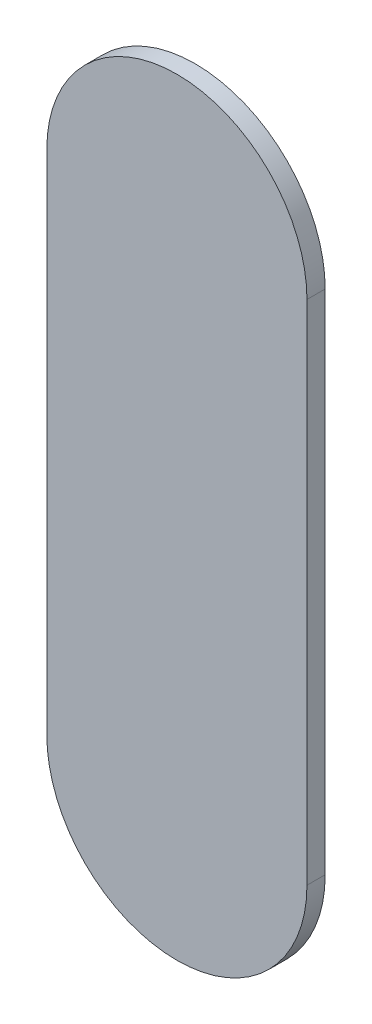
ISO-10303-21;
HEADER;
FILE_DESCRIPTION(('STEP AP214'),'2;1');
FILE_NAME('part.step','',(''),(''),'','','');
FILE_SCHEMA(('AUTOMOTIVE_DESIGN { 1 0 10303 214 1 1 1 1 }'));
ENDSEC;
DATA;
#1=APPLICATION_CONTEXT('core data for automotive mechanical design processes');
#2=APPLICATION_PROTOCOL_DEFINITION('international standard','automotive_design',2000,#1);
#3=PRODUCT_CONTEXT('',#1,'mechanical');
#4=PRODUCT('Part','Part','',(#3));
#5=PRODUCT_RELATED_PRODUCT_CATEGORY('part','',(#4));
#6=PRODUCT_DEFINITION_FORMATION('','',#4);
#7=PRODUCT_DEFINITION_CONTEXT('part definition',#1,'design');
#8=PRODUCT_DEFINITION('design','',#6,#7);
#9=PRODUCT_DEFINITION_SHAPE('','',#8);
#10=(LENGTH_UNIT() NAMED_UNIT(*) SI_UNIT(.MILLI.,.METRE.));
#11=(NAMED_UNIT(*) PLANE_ANGLE_UNIT() SI_UNIT($,.RADIAN.));
#12=(NAMED_UNIT(*) SI_UNIT($,.STERADIAN.) SOLID_ANGLE_UNIT());
#13=UNCERTAINTY_MEASURE_WITH_UNIT(LENGTH_MEASURE(1.E-05),#10,'distance_accuracy_value','');
#14=(GEOMETRIC_REPRESENTATION_CONTEXT(3) GLOBAL_UNCERTAINTY_ASSIGNED_CONTEXT((#13)) GLOBAL_UNIT_ASSIGNED_CONTEXT((#10,
#11,#12)) REPRESENTATION_CONTEXT('',''));
#15=CARTESIAN_POINT('',(0.,0.,0.));
#16=DIRECTION('',(0.,0.,1.));
#17=DIRECTION('',(1.,0.,0.));
#18=AXIS2_PLACEMENT_3D('',#15,#16,#17);
#19=CARTESIAN_POINT('',(83.5775,-106.1525,1.635));
#20=DIRECTION('',(0.,0.,1.));
#21=DIRECTION('',(1.,0.,0.));
#22=AXIS2_PLACEMENT_3D('',#19,#20,#21);
#23=PLANE('',#22);
#24=DIRECTION('',(0.,1.,0.));
#25=VECTOR('',#24,1.);
#26=CARTESIAN_POINT('',(83.5775,-106.1525,1.635));
#27=LINE('',#26,#25);
#28=CARTESIAN_POINT('',(83.5775,-106.1525,1.635));
#29=VERTEX_POINT('',#28);
#30=CARTESIAN_POINT('',(83.5775,-105.1775,1.635));
#31=VERTEX_POINT('',#30);
#32=EDGE_CURVE('E70',#29,#31,#27,.T.);
#33=ORIENTED_EDGE('',*,*,#32,.T.);
#34=CARTESIAN_POINT('',(83.3275,-105.1775,1.635));
#35=DIRECTION('',(0.,0.,1.));
#36=DIRECTION('',(1.,0.,0.));
#37=AXIS2_PLACEMENT_3D('',#34,#35,#36);
#38=CIRCLE('',#37,0.25);
#39=CARTESIAN_POINT('',(83.0775,-105.1775,1.635));
#40=VERTEX_POINT('',#39);
#41=EDGE_CURVE('E68',#31,#40,#38,.T.);
#42=ORIENTED_EDGE('',*,*,#41,.T.);
#43=DIRECTION('',(0.,-1.,0.));
#44=VECTOR('',#43,1.);
#45=CARTESIAN_POINT('',(83.0775,-105.1775,1.635));
#46=LINE('',#45,#44);
#47=CARTESIAN_POINT('',(83.0775,-106.1525,1.635));
#48=VERTEX_POINT('',#47);
#49=EDGE_CURVE('E21',#40,#48,#46,.T.);
#50=ORIENTED_EDGE('',*,*,#49,.T.);
#51=CARTESIAN_POINT('',(83.3275,-106.1525,1.635));
#52=DIRECTION('',(0.,0.,1.));
#53=DIRECTION('',(-1.,0.,0.));
#54=AXIS2_PLACEMENT_3D('',#51,#52,#53);
#55=CIRCLE('',#54,0.25);
#56=EDGE_CURVE('E11',#48,#29,#55,.T.);
#57=ORIENTED_EDGE('',*,*,#56,.T.);
#58=EDGE_LOOP('',(#33,#42,#50,#57));
#59=FACE_BOUND('',#58,.T.);
#60=ADVANCED_FACE('F17',(#59),#23,.T.);
#61=CARTESIAN_POINT('',(83.5775,-106.1525,1.6));
#62=DIRECTION('',(0.,0.,1.));
#63=DIRECTION('',(1.,0.,0.));
#64=AXIS2_PLACEMENT_3D('',#61,#62,#63);
#65=PLANE('',#64);
#66=CARTESIAN_POINT('',(83.3275,-106.1525,1.6));
#67=DIRECTION('',(0.,0.,1.));
#68=DIRECTION('',(-1.,0.,0.));
#69=AXIS2_PLACEMENT_3D('',#66,#67,#68);
#70=CIRCLE('',#69,0.25);
#71=CARTESIAN_POINT('',(83.0775,-106.1525,1.6));
#72=VERTEX_POINT('',#71);
#73=CARTESIAN_POINT('',(83.5775,-106.1525,1.6));
#74=VERTEX_POINT('',#73);
#75=EDGE_CURVE('E28',#72,#74,#70,.T.);
#76=ORIENTED_EDGE('',*,*,#75,.F.);
#77=DIRECTION('',(0.,-1.,0.));
#78=VECTOR('',#77,1.);
#79=CARTESIAN_POINT('',(83.0775,-105.1775,1.6));
#80=LINE('',#79,#78);
#81=CARTESIAN_POINT('',(83.0775,-105.1775,1.6));
#82=VERTEX_POINT('',#81);
#83=EDGE_CURVE('E75',#82,#72,#80,.T.);
#84=ORIENTED_EDGE('',*,*,#83,.F.);
#85=CARTESIAN_POINT('',(83.3275,-105.1775,1.6));
#86=DIRECTION('',(0.,0.,1.));
#87=DIRECTION('',(1.,0.,0.));
#88=AXIS2_PLACEMENT_3D('',#85,#86,#87);
#89=CIRCLE('',#88,0.25);
#90=CARTESIAN_POINT('',(83.5775,-105.1775,1.6));
#91=VERTEX_POINT('',#90);
#92=EDGE_CURVE('E79',#91,#82,#89,.T.);
#93=ORIENTED_EDGE('',*,*,#92,.F.);
#94=DIRECTION('',(0.,1.,0.));
#95=VECTOR('',#94,1.);
#96=CARTESIAN_POINT('',(83.5775,-106.1525,1.6));
#97=LINE('',#96,#95);
#98=EDGE_CURVE('E98',#74,#91,#97,.T.);
#99=ORIENTED_EDGE('',*,*,#98,.F.);
#100=EDGE_LOOP('',(#76,#84,#93,#99));
#101=FACE_BOUND('',#100,.T.);
#102=ADVANCED_FACE('F19',(#101),#65,.F.);
#103=CARTESIAN_POINT('',(83.3275,-106.1525,1.6));
#104=DIRECTION('',(0.,0.,-1.));
#105=DIRECTION('',(-1.,0.,0.));
#106=AXIS2_PLACEMENT_3D('',#103,#104,#105);
#107=CYLINDRICAL_SURFACE('',#106,0.25);
#108=ORIENTED_EDGE('',*,*,#75,.T.);
#109=DIRECTION('',(0.,0.,1.));
#110=VECTOR('',#109,1.);
#111=CARTESIAN_POINT('',(83.5775,-106.1525,1.6));
#112=LINE('',#111,#110);
#113=EDGE_CURVE('E86',#74,#29,#112,.T.);
#114=ORIENTED_EDGE('',*,*,#113,.T.);
#115=ORIENTED_EDGE('',*,*,#56,.F.);
#116=DIRECTION('',(0.,0.,1.));
#117=VECTOR('',#116,1.);
#118=CARTESIAN_POINT('',(83.0775,-106.1525,1.6));
#119=LINE('',#118,#117);
#120=EDGE_CURVE('E63',#72,#48,#119,.T.);
#121=ORIENTED_EDGE('',*,*,#120,.F.);
#122=EDGE_LOOP('',(#108,#114,#115,#121));
#123=FACE_BOUND('',#122,.T.);
#124=ADVANCED_FACE('F109',(#123),#107,.T.);
#125=CARTESIAN_POINT('',(83.0775,-105.1775,1.6));
#126=DIRECTION('',(1.,0.,0.));
#127=DIRECTION('',(0.,1.,0.));
#128=AXIS2_PLACEMENT_3D('',#125,#126,#127);
#129=PLANE('',#128);
#130=ORIENTED_EDGE('',*,*,#83,.T.);
#131=ORIENTED_EDGE('',*,*,#120,.T.);
#132=ORIENTED_EDGE('',*,*,#49,.F.);
#133=DIRECTION('',(0.,0.,1.));
#134=VECTOR('',#133,1.);
#135=CARTESIAN_POINT('',(83.0775,-105.1775,1.6));
#136=LINE('',#135,#134);
#137=EDGE_CURVE('E61',#82,#40,#136,.T.);
#138=ORIENTED_EDGE('',*,*,#137,.F.);
#139=EDGE_LOOP('',(#130,#131,#132,#138));
#140=FACE_BOUND('',#139,.T.);
#141=ADVANCED_FACE('F59',(#140),#129,.F.);
#142=CARTESIAN_POINT('',(83.3275,-105.1775,1.6));
#143=DIRECTION('',(0.,0.,-1.));
#144=DIRECTION('',(1.,0.,0.));
#145=AXIS2_PLACEMENT_3D('',#142,#143,#144);
#146=CYLINDRICAL_SURFACE('',#145,0.25);
#147=ORIENTED_EDGE('',*,*,#92,.T.);
#148=ORIENTED_EDGE('',*,*,#137,.T.);
#149=ORIENTED_EDGE('',*,*,#41,.F.);
#150=DIRECTION('',(0.,0.,1.));
#151=VECTOR('',#150,1.);
#152=CARTESIAN_POINT('',(83.5775,-105.1775,1.6));
#153=LINE('',#152,#151);
#154=EDGE_CURVE('E100',#91,#31,#153,.T.);
#155=ORIENTED_EDGE('',*,*,#154,.F.);
#156=EDGE_LOOP('',(#147,#148,#149,#155));
#157=FACE_BOUND('',#156,.T.);
#158=ADVANCED_FACE('F77',(#157),#146,.T.);
#159=CARTESIAN_POINT('',(83.5775,-106.1525,1.6));
#160=DIRECTION('',(-1.,0.,0.));
#161=DIRECTION('',(0.,0.,1.));
#162=AXIS2_PLACEMENT_3D('',#159,#160,#161);
#163=PLANE('',#162);
#164=ORIENTED_EDGE('',*,*,#98,.T.);
#165=ORIENTED_EDGE('',*,*,#154,.T.);
#166=ORIENTED_EDGE('',*,*,#32,.F.);
#167=ORIENTED_EDGE('',*,*,#113,.F.);
#168=EDGE_LOOP('',(#164,#165,#166,#167));
#169=FACE_BOUND('',#168,.T.);
#170=ADVANCED_FACE('F115',(#169),#163,.F.);
#171=CLOSED_SHELL('',(#60,#102,#124,#141,#158,#170));
#172=MANIFOLD_SOLID_BREP('B1',#171);
#173=ADVANCED_BREP_SHAPE_REPRESENTATION('',(#18,#172),#14);
#174=SHAPE_DEFINITION_REPRESENTATION(#9,#173);
ENDSEC;
END-ISO-10303-21;
